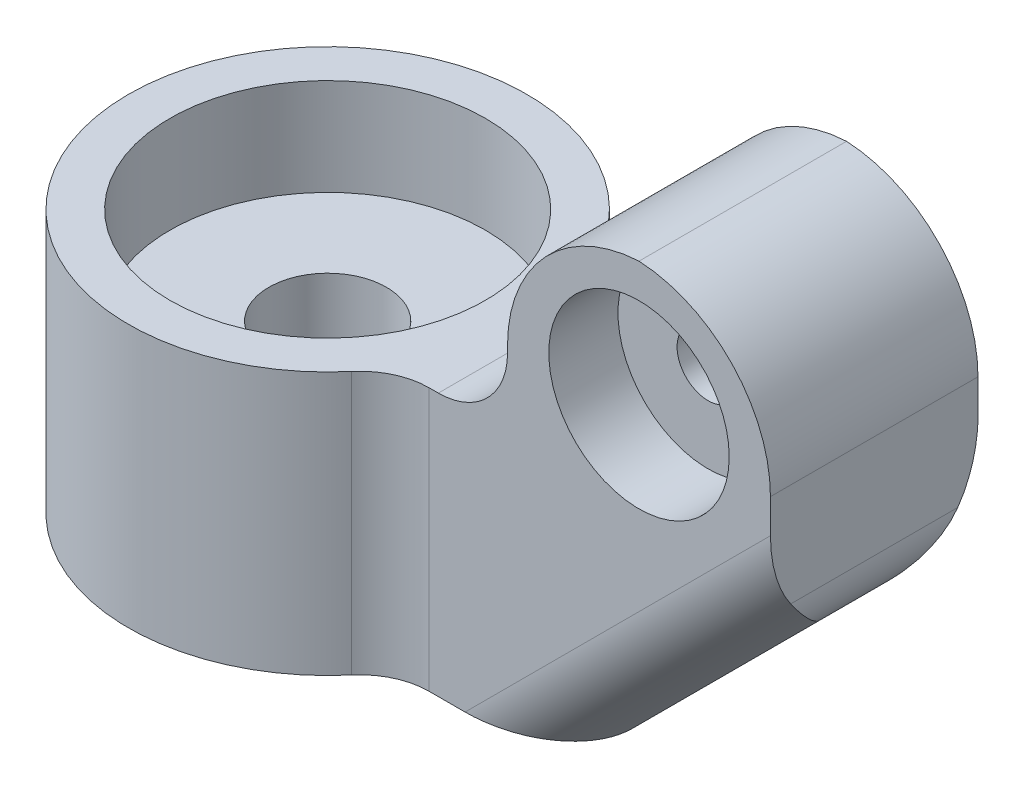
ISO-10303-21;
HEADER;
FILE_DESCRIPTION(('STEP AP214'),'2;1');
FILE_NAME('part.step','',(''),(''),'','','');
FILE_SCHEMA(('AUTOMOTIVE_DESIGN { 1 0 10303 214 1 1 1 1 }'));
ENDSEC;
DATA;
#1=APPLICATION_CONTEXT('core data for automotive mechanical design processes');
#2=APPLICATION_PROTOCOL_DEFINITION('international standard','automotive_design',2000,#1);
#3=PRODUCT_CONTEXT('',#1,'mechanical');
#4=PRODUCT('Part','Part','',(#3));
#5=PRODUCT_RELATED_PRODUCT_CATEGORY('part','',(#4));
#6=PRODUCT_DEFINITION_FORMATION('','',#4);
#7=PRODUCT_DEFINITION_CONTEXT('part definition',#1,'design');
#8=PRODUCT_DEFINITION('design','',#6,#7);
#9=PRODUCT_DEFINITION_SHAPE('','',#8);
#10=(LENGTH_UNIT() NAMED_UNIT(*) SI_UNIT(.MILLI.,.METRE.));
#11=(NAMED_UNIT(*) PLANE_ANGLE_UNIT() SI_UNIT($,.RADIAN.));
#12=(NAMED_UNIT(*) SI_UNIT($,.STERADIAN.) SOLID_ANGLE_UNIT());
#13=UNCERTAINTY_MEASURE_WITH_UNIT(LENGTH_MEASURE(1.E-05),#10,'distance_accuracy_value','');
#14=(GEOMETRIC_REPRESENTATION_CONTEXT(3) GLOBAL_UNCERTAINTY_ASSIGNED_CONTEXT((#13)) GLOBAL_UNIT_ASSIGNED_CONTEXT((#10,
#11,#12)) REPRESENTATION_CONTEXT('',''));
#15=CARTESIAN_POINT('',(0.,0.,0.));
#16=DIRECTION('',(0.,0.,1.));
#17=DIRECTION('',(1.,0.,0.));
#18=AXIS2_PLACEMENT_3D('',#15,#16,#17);
#19=CARTESIAN_POINT('',(-30.,-25.52,0.));
#20=DIRECTION('',(0.,1.,0.));
#21=DIRECTION('',(0.,0.,1.));
#22=AXIS2_PLACEMENT_3D('',#19,#20,#21);
#23=CYLINDRICAL_SURFACE('',#22,4.25);
#24=CARTESIAN_POINT('',(-30.,-13.52,0.));
#25=DIRECTION('',(0.,1.,0.));
#26=DIRECTION('',(0.,0.,1.));
#27=AXIS2_PLACEMENT_3D('',#24,#25,#26);
#28=CIRCLE('',#27,4.25);
#29=CARTESIAN_POINT('',(-30.,-13.52,4.25));
#30=VERTEX_POINT('',#29);
#31=EDGE_CURVE('E385',#30,#30,#28,.T.);
#32=ORIENTED_EDGE('',*,*,#31,.T.);
#33=EDGE_LOOP('',(#32));
#34=FACE_BOUND('',#33,.T.);
#35=CARTESIAN_POINT('',(-30.,-18.52,0.));
#36=DIRECTION('',(0.,-1.,0.));
#37=DIRECTION('',(1.,0.,0.));
#38=AXIS2_PLACEMENT_3D('',#35,#36,#37);
#39=CIRCLE('',#38,4.25);
#40=CARTESIAN_POINT('',(-25.75,-18.52,0.));
#41=VERTEX_POINT('',#40);
#42=EDGE_CURVE('E191',#41,#41,#39,.F.);
#43=ORIENTED_EDGE('',*,*,#42,.F.);
#44=EDGE_LOOP('',(#43));
#45=FACE_BOUND('',#44,.T.);
#46=ADVANCED_FACE('F46',(#34,#45),#23,.F.);
#47=CARTESIAN_POINT('',(0.,0.,7.5));
#48=DIRECTION('',(0.,0.,-1.));
#49=DIRECTION('',(-1.,0.,0.));
#50=AXIS2_PLACEMENT_3D('',#47,#48,#49);
#51=CYLINDRICAL_SURFACE('',#50,2.25);
#52=CARTESIAN_POINT('',(0.,0.,-2.5));
#53=DIRECTION('',(0.,0.,1.));
#54=DIRECTION('',(1.,0.,0.));
#55=AXIS2_PLACEMENT_3D('',#52,#53,#54);
#56=CIRCLE('',#55,2.25);
#57=CARTESIAN_POINT('',(2.25,0.,-2.5));
#58=VERTEX_POINT('',#57);
#59=EDGE_CURVE('E303',#58,#58,#56,.T.);
#60=ORIENTED_EDGE('',*,*,#59,.F.);
#61=EDGE_LOOP('',(#60));
#62=FACE_BOUND('',#61,.T.);
#63=CARTESIAN_POINT('',(0.,0.,2.5));
#64=DIRECTION('',(0.,0.,1.));
#65=DIRECTION('',(1.,0.,0.));
#66=AXIS2_PLACEMENT_3D('',#63,#64,#65);
#67=CIRCLE('',#66,2.25);
#68=CARTESIAN_POINT('',(2.25,0.,2.5));
#69=VERTEX_POINT('',#68);
#70=EDGE_CURVE('E299',#69,#69,#67,.T.);
#71=ORIENTED_EDGE('',*,*,#70,.T.);
#72=EDGE_LOOP('',(#71));
#73=FACE_BOUND('',#72,.T.);
#74=ADVANCED_FACE('F406',(#62,#73),#51,.F.);
#75=CARTESIAN_POINT('',(0.,-6.52,7.5));
#76=DIRECTION('',(0.,1.,0.));
#77=DIRECTION('',(0.,0.,1.));
#78=AXIS2_PLACEMENT_3D('',#75,#76,#77);
#79=PLANE('',#78);
#80=CARTESIAN_POINT('',(-30.,-6.52,0.));
#81=DIRECTION('',(0.,1.,0.));
#82=DIRECTION('',(0.,0.,1.));
#83=AXIS2_PLACEMENT_3D('',#80,#81,#82);
#84=CIRCLE('',#83,11.4);
#85=CARTESIAN_POINT('',(-30.,-6.52,11.4));
#86=VERTEX_POINT('',#85);
#87=EDGE_CURVE('E379',#86,#86,#84,.T.);
#88=ORIENTED_EDGE('',*,*,#87,.F.);
#89=EDGE_LOOP('',(#88));
#90=FACE_BOUND('',#89,.T.);
#91=DIRECTION('',(1.,0.,0.));
#92=VECTOR('',#91,1.);
#93=CARTESIAN_POINT('',(0.,-6.52,7.5));
#94=LINE('',#93,#92);
#95=CARTESIAN_POINT('',(-15.1638953899617,-6.52,7.5));
#96=VERTEX_POINT('',#95);
#97=CARTESIAN_POINT('',(-14.5,-6.52,7.5));
#98=VERTEX_POINT('',#97);
#99=EDGE_CURVE('E295',#96,#98,#94,.T.);
#100=ORIENTED_EDGE('',*,*,#99,.T.);
#101=DIRECTION('',(0.,0.,-1.));
#102=VECTOR('',#101,1.);
#103=CARTESIAN_POINT('',(-14.5,-6.52,-7.5));
#104=LINE('',#103,#102);
#105=CARTESIAN_POINT('',(-14.5,-6.52,-7.5));
#106=VERTEX_POINT('',#105);
#107=EDGE_CURVE('E196',#98,#106,#104,.T.);
#108=ORIENTED_EDGE('',*,*,#107,.T.);
#109=DIRECTION('',(1.,0.,0.));
#110=VECTOR('',#109,1.);
#111=CARTESIAN_POINT('',(0.,-6.52,-7.5));
#112=LINE('',#111,#110);
#113=CARTESIAN_POINT('',(-15.1638953899617,-6.52,-7.5));
#114=VERTEX_POINT('',#113);
#115=EDGE_CURVE('E163',#114,#106,#112,.T.);
#116=ORIENTED_EDGE('',*,*,#115,.F.);
#117=CARTESIAN_POINT('',(-15.1638953899617,-6.52,-12.5));
#118=DIRECTION('',(0.,1.,0.));
#119=DIRECTION('',(0.,0.,1.));
#120=AXIS2_PLACEMENT_3D('',#117,#118,#119);
#121=CIRCLE('',#120,5.);
#122=CARTESIAN_POINT('',(-18.987633691518,-6.52,-9.27835051546392));
#123=VERTEX_POINT('',#122);
#124=EDGE_CURVE('E175',#114,#123,#121,.F.);
#125=ORIENTED_EDGE('',*,*,#124,.T.);
#126=CARTESIAN_POINT('',(-30.,-6.52,0.));
#127=DIRECTION('',(0.,1.,0.));
#128=DIRECTION('',(0.,0.,1.));
#129=AXIS2_PLACEMENT_3D('',#126,#127,#128);
#130=CIRCLE('',#129,14.4);
#131=CARTESIAN_POINT('',(-18.987633691518,-6.52,9.27835051546392));
#132=VERTEX_POINT('',#131);
#133=EDGE_CURVE('E323',#123,#132,#130,.T.);
#134=ORIENTED_EDGE('',*,*,#133,.T.);
#135=CARTESIAN_POINT('',(-15.1638953899617,-6.52,12.5));
#136=DIRECTION('',(0.,1.,0.));
#137=DIRECTION('',(0.,0.,1.));
#138=AXIS2_PLACEMENT_3D('',#135,#136,#137);
#139=CIRCLE('',#138,5.);
#140=EDGE_CURVE('E214',#132,#96,#139,.F.);
#141=ORIENTED_EDGE('',*,*,#140,.T.);
#142=EDGE_LOOP('',(#100,#108,#116,#125,#134,#141));
#143=FACE_BOUND('',#142,.T.);
#144=ADVANCED_FACE('F343',(#90,#143),#79,.T.);
#145=CARTESIAN_POINT('',(0.,-25.52,7.5));
#146=DIRECTION('',(0.,-1.,0.));
#147=DIRECTION('',(1.,0.,0.));
#148=AXIS2_PLACEMENT_3D('',#145,#146,#147);
#149=PLANE('',#148);
#150=CARTESIAN_POINT('',(-30.,-25.52,0.));
#151=DIRECTION('',(0.,-1.,0.));
#152=DIRECTION('',(1.,0.,0.));
#153=AXIS2_PLACEMENT_3D('',#150,#151,#152);
#154=CIRCLE('',#153,11.4);
#155=CARTESIAN_POINT('',(-18.6,-25.52,0.));
#156=VERTEX_POINT('',#155);
#157=EDGE_CURVE('E243',#156,#156,#154,.T.);
#158=ORIENTED_EDGE('',*,*,#157,.F.);
#159=EDGE_LOOP('',(#158));
#160=FACE_BOUND('',#159,.T.);
#161=DIRECTION('',(-1.,0.,0.));
#162=VECTOR('',#161,1.);
#163=CARTESIAN_POINT('',(0.,-25.52,-7.5));
#164=LINE('',#163,#162);
#165=CARTESIAN_POINT('',(-12.5710678118655,-25.52,-7.5));
#166=VERTEX_POINT('',#165);
#167=CARTESIAN_POINT('',(-15.1638953899617,-25.52,-7.5));
#168=VERTEX_POINT('',#167);
#169=EDGE_CURVE('E150',#166,#168,#164,.T.);
#170=ORIENTED_EDGE('',*,*,#169,.F.);
#171=CARTESIAN_POINT('',(-12.5710678118655,-25.52,-2.5));
#172=DIRECTION('',(0.,-1.,0.));
#173=DIRECTION('',(1.,0.,0.));
#174=AXIS2_PLACEMENT_3D('',#171,#172,#173);
#175=ELLIPSE('',#174,7.07106781186548,5.);
#176=CARTESIAN_POINT('',(-5.5,-25.52,-2.5));
#177=VERTEX_POINT('',#176);
#178=EDGE_CURVE('E249',#166,#177,#175,.T.);
#179=ORIENTED_EDGE('',*,*,#178,.T.);
#180=DIRECTION('',(0.,0.,-1.));
#181=VECTOR('',#180,1.);
#182=CARTESIAN_POINT('',(-5.5,-25.52,7.5));
#183=LINE('',#182,#181);
#184=CARTESIAN_POINT('',(-5.5,-25.52,2.5));
#185=VERTEX_POINT('',#184);
#186=EDGE_CURVE('E180',#185,#177,#183,.T.);
#187=ORIENTED_EDGE('',*,*,#186,.F.);
#188=CARTESIAN_POINT('',(-12.5710678118655,-25.52,2.5));
#189=DIRECTION('',(0.,-1.,0.));
#190=DIRECTION('',(-1.,0.,0.));
#191=AXIS2_PLACEMENT_3D('',#188,#189,#190);
#192=ELLIPSE('',#191,7.07106781186548,5.);
#193=CARTESIAN_POINT('',(-12.5710678118655,-25.52,7.5));
#194=VERTEX_POINT('',#193);
#195=EDGE_CURVE('E246',#185,#194,#192,.T.);
#196=ORIENTED_EDGE('',*,*,#195,.T.);
#197=DIRECTION('',(-1.,0.,0.));
#198=VECTOR('',#197,1.);
#199=CARTESIAN_POINT('',(0.,-25.52,7.5));
#200=LINE('',#199,#198);
#201=CARTESIAN_POINT('',(-15.1638953899617,-25.52,7.5));
#202=VERTEX_POINT('',#201);
#203=EDGE_CURVE('E332',#194,#202,#200,.T.);
#204=ORIENTED_EDGE('',*,*,#203,.T.);
#205=CARTESIAN_POINT('',(-15.1638953899617,-25.52,12.5));
#206=DIRECTION('',(0.,-1.,0.));
#207=DIRECTION('',(1.,0.,0.));
#208=AXIS2_PLACEMENT_3D('',#205,#206,#207);
#209=CIRCLE('',#208,5.);
#210=CARTESIAN_POINT('',(-18.987633691518,-25.52,9.27835051546392));
#211=VERTEX_POINT('',#210);
#212=EDGE_CURVE('E217',#202,#211,#209,.F.);
#213=ORIENTED_EDGE('',*,*,#212,.T.);
#214=CARTESIAN_POINT('',(-30.,-25.52,0.));
#215=DIRECTION('',(0.,1.,0.));
#216=DIRECTION('',(0.,0.,1.));
#217=AXIS2_PLACEMENT_3D('',#214,#215,#216);
#218=CIRCLE('',#217,14.4);
#219=CARTESIAN_POINT('',(-18.987633691518,-25.52,-9.27835051546392));
#220=VERTEX_POINT('',#219);
#221=EDGE_CURVE('E170',#220,#211,#218,.T.);
#222=ORIENTED_EDGE('',*,*,#221,.F.);
#223=CARTESIAN_POINT('',(-15.1638953899617,-25.52,-12.5));
#224=DIRECTION('',(0.,-1.,0.));
#225=DIRECTION('',(1.,0.,0.));
#226=AXIS2_PLACEMENT_3D('',#223,#224,#225);
#227=CIRCLE('',#226,5.);
#228=EDGE_CURVE('E167',#220,#168,#227,.F.);
#229=ORIENTED_EDGE('',*,*,#228,.T.);
#230=EDGE_LOOP('',(#170,#179,#187,#196,#204,#213,#222,#229));
#231=FACE_BOUND('',#230,.T.);
#232=ADVANCED_FACE('F168',(#160,#231),#149,.T.);
#233=CARTESIAN_POINT('',(10.01,-10.01,7.5));
#234=DIRECTION('',(0.707106781186547,-0.707106781186547,0.));
#235=DIRECTION('',(0.707106781186548,0.707106781186548,0.));
#236=AXIS2_PLACEMENT_3D('',#233,#234,#235);
#237=PLANE('',#236);
#238=ORIENTED_EDGE('',*,*,#186,.T.);
#239=DIRECTION('',(-0.707106781186548,-0.707106781186548,0.));
#240=VECTOR('',#239,1.);
#241=CARTESIAN_POINT('',(9.5,-10.52,-2.5));
#242=LINE('',#241,#240);
#243=CARTESIAN_POINT('',(8.03553390593274,-11.9844660940673,-2.5));
#244=VERTEX_POINT('',#243);
#245=EDGE_CURVE('E258',#177,#244,#242,.F.);
#246=ORIENTED_EDGE('',*,*,#245,.T.);
#247=DIRECTION('',(0.,0.,-1.));
#248=VECTOR('',#247,1.);
#249=CARTESIAN_POINT('',(8.03553390593274,-11.9844660940673,7.5));
#250=LINE('',#249,#248);
#251=CARTESIAN_POINT('',(8.03553390593274,-11.9844660940673,2.5));
#252=VERTEX_POINT('',#251);
#253=EDGE_CURVE('E252',#244,#252,#250,.F.);
#254=ORIENTED_EDGE('',*,*,#253,.T.);
#255=DIRECTION('',(-0.707106781186548,-0.707106781186548,0.));
#256=VECTOR('',#255,1.);
#257=CARTESIAN_POINT('',(10.01,-10.01,2.5));
#258=LINE('',#257,#256);
#259=EDGE_CURVE('E255',#252,#185,#258,.T.);
#260=ORIENTED_EDGE('',*,*,#259,.T.);
#261=EDGE_LOOP('',(#238,#246,#254,#260));
#262=FACE_BOUND('',#261,.T.);
#263=ADVANCED_FACE('F283',(#262),#237,.T.);
#264=CARTESIAN_POINT('',(9.5,0.,7.5));
#265=DIRECTION('',(1.,0.,0.));
#266=DIRECTION('',(0.,1.,0.));
#267=AXIS2_PLACEMENT_3D('',#264,#265,#266);
#268=PLANE('',#267);
#269=DIRECTION('',(0.,0.,-1.));
#270=VECTOR('',#269,1.);
#271=CARTESIAN_POINT('',(9.5,-8.44893218813453,7.5));
#272=LINE('',#271,#270);
#273=CARTESIAN_POINT('',(9.5,-8.44893218813453,6.03553390593274));
#274=VERTEX_POINT('',#273);
#275=CARTESIAN_POINT('',(9.5,-8.44893218813453,-6.03553390593274));
#276=VERTEX_POINT('',#275);
#277=EDGE_CURVE('E64',#274,#276,#272,.T.);
#278=ORIENTED_EDGE('',*,*,#277,.T.);
#279=CARTESIAN_POINT('',(9.5,-3.44893218813453,-2.5));
#280=DIRECTION('',(1.,0.,0.));
#281=DIRECTION('',(0.,1.,0.));
#282=AXIS2_PLACEMENT_3D('',#279,#280,#281);
#283=ELLIPSE('',#282,7.07106781186547,5.);
#284=CARTESIAN_POINT('',(9.5,-3.44893218813453,-7.5));
#285=VERTEX_POINT('',#284);
#286=EDGE_CURVE('E56',#276,#285,#283,.T.);
#287=ORIENTED_EDGE('',*,*,#286,.T.);
#288=DIRECTION('',(0.,-1.,0.));
#289=VECTOR('',#288,1.);
#290=CARTESIAN_POINT('',(9.5,0.,-7.5));
#291=LINE('',#290,#289);
#292=CARTESIAN_POINT('',(9.5,-1.,-7.5));
#293=VERTEX_POINT('',#292);
#294=EDGE_CURVE('E162',#293,#285,#291,.T.);
#295=ORIENTED_EDGE('',*,*,#294,.F.);
#296=DIRECTION('',(0.,0.,-1.));
#297=VECTOR('',#296,1.);
#298=CARTESIAN_POINT('',(9.5,-1.,7.5));
#299=LINE('',#298,#297);
#300=CARTESIAN_POINT('',(9.5,-1.,7.5));
#301=VERTEX_POINT('',#300);
#302=EDGE_CURVE('E236',#293,#301,#299,.F.);
#303=ORIENTED_EDGE('',*,*,#302,.T.);
#304=DIRECTION('',(0.,-1.,0.));
#305=VECTOR('',#304,1.);
#306=CARTESIAN_POINT('',(9.5,0.,7.5));
#307=LINE('',#306,#305);
#308=CARTESIAN_POINT('',(9.5,-3.44893218813453,7.5));
#309=VERTEX_POINT('',#308);
#310=EDGE_CURVE('E335',#301,#309,#307,.T.);
#311=ORIENTED_EDGE('',*,*,#310,.T.);
#312=CARTESIAN_POINT('',(9.5,-3.44893218813453,2.5));
#313=DIRECTION('',(1.,0.,0.));
#314=DIRECTION('',(0.,-1.,0.));
#315=AXIS2_PLACEMENT_3D('',#312,#313,#314);
#316=ELLIPSE('',#315,7.07106781186547,5.);
#317=EDGE_CURVE('E69',#309,#274,#316,.T.);
#318=ORIENTED_EDGE('',*,*,#317,.T.);
#319=EDGE_LOOP('',(#278,#287,#295,#303,#311,#318));
#320=FACE_BOUND('',#319,.T.);
#321=ADVANCED_FACE('F287',(#320),#268,.T.);
#322=CARTESIAN_POINT('',(-9.5,0.,7.5));
#323=DIRECTION('',(-1.,0.,0.));
#324=DIRECTION('',(0.,0.,1.));
#325=AXIS2_PLACEMENT_3D('',#322,#323,#324);
#326=PLANE('',#325);
#327=DIRECTION('',(0.,1.,0.));
#328=VECTOR('',#327,1.);
#329=CARTESIAN_POINT('',(-9.5,0.,7.5));
#330=LINE('',#329,#328);
#331=CARTESIAN_POINT('',(-9.5,-1.52,7.5));
#332=VERTEX_POINT('',#331);
#333=CARTESIAN_POINT('',(-9.5,-1.,7.5));
#334=VERTEX_POINT('',#333);
#335=EDGE_CURVE('E188',#332,#334,#330,.T.);
#336=ORIENTED_EDGE('',*,*,#335,.T.);
#337=DIRECTION('',(0.,0.,-1.));
#338=VECTOR('',#337,1.);
#339=CARTESIAN_POINT('',(-9.5,-1.,7.5));
#340=LINE('',#339,#338);
#341=CARTESIAN_POINT('',(-9.5,-1.,-7.5));
#342=VERTEX_POINT('',#341);
#343=EDGE_CURVE('E220',#334,#342,#340,.T.);
#344=ORIENTED_EDGE('',*,*,#343,.T.);
#345=DIRECTION('',(0.,1.,0.));
#346=VECTOR('',#345,1.);
#347=CARTESIAN_POINT('',(-9.5,0.,-7.5));
#348=LINE('',#347,#346);
#349=CARTESIAN_POINT('',(-9.5,-1.52,-7.5));
#350=VERTEX_POINT('',#349);
#351=EDGE_CURVE('E291',#350,#342,#348,.T.);
#352=ORIENTED_EDGE('',*,*,#351,.F.);
#353=DIRECTION('',(0.,0.,-1.));
#354=VECTOR('',#353,1.);
#355=CARTESIAN_POINT('',(-9.5,-1.52,7.5));
#356=LINE('',#355,#354);
#357=EDGE_CURVE('E200',#350,#332,#356,.F.);
#358=ORIENTED_EDGE('',*,*,#357,.T.);
#359=EDGE_LOOP('',(#336,#344,#352,#358));
#360=FACE_BOUND('',#359,.T.);
#361=ADVANCED_FACE('F354',(#360),#326,.T.);
#362=CARTESIAN_POINT('',(0.,0.,7.5));
#363=DIRECTION('',(0.,0.,1.));
#364=DIRECTION('',(1.,0.,0.));
#365=AXIS2_PLACEMENT_3D('',#362,#363,#364);
#366=PLANE('',#365);
#367=ORIENTED_EDGE('',*,*,#203,.F.);
#368=DIRECTION('',(-0.707106781186548,-0.707106781186548,0.));
#369=VECTOR('',#368,1.);
#370=CARTESIAN_POINT('',(6.47446609406726,-6.47446609406726,7.5));
#371=LINE('',#370,#369);
#372=EDGE_CURVE('E12',#194,#309,#371,.F.);
#373=ORIENTED_EDGE('',*,*,#372,.T.);
#374=ORIENTED_EDGE('',*,*,#310,.F.);
#375=CARTESIAN_POINT('',(-0.5,-1.,7.5));
#376=DIRECTION('',(0.,0.,1.));
#377=DIRECTION('',(1.,0.,0.));
#378=AXIS2_PLACEMENT_3D('',#375,#376,#377);
#379=CIRCLE('',#378,10.);
#380=CARTESIAN_POINT('',(0.,8.98749217771909,7.5));
#381=VERTEX_POINT('',#380);
#382=EDGE_CURVE('E230',#301,#381,#379,.T.);
#383=ORIENTED_EDGE('',*,*,#382,.T.);
#384=CARTESIAN_POINT('',(0.5,-1.,7.5));
#385=DIRECTION('',(0.,0.,1.));
#386=DIRECTION('',(1.,0.,0.));
#387=AXIS2_PLACEMENT_3D('',#384,#385,#386);
#388=CIRCLE('',#387,10.);
#389=EDGE_CURVE('E233',#381,#334,#388,.T.);
#390=ORIENTED_EDGE('',*,*,#389,.T.);
#391=ORIENTED_EDGE('',*,*,#335,.F.);
#392=CARTESIAN_POINT('',(-14.5,-1.52,7.5));
#393=DIRECTION('',(0.,0.,1.));
#394=DIRECTION('',(1.,0.,0.));
#395=AXIS2_PLACEMENT_3D('',#392,#393,#394);
#396=CIRCLE('',#395,5.);
#397=EDGE_CURVE('E211',#332,#98,#396,.F.);
#398=ORIENTED_EDGE('',*,*,#397,.T.);
#399=ORIENTED_EDGE('',*,*,#99,.F.);
#400=DIRECTION('',(0.,-1.,0.));
#401=VECTOR('',#400,1.);
#402=CARTESIAN_POINT('',(-15.1638953899617,-25.52,7.5));
#403=LINE('',#402,#401);
#404=EDGE_CURVE('E203',#96,#202,#403,.T.);
#405=ORIENTED_EDGE('',*,*,#404,.T.);
#406=EDGE_LOOP('',(#367,#373,#374,#383,#390,#391,#398,#399,#405));
#407=FACE_BOUND('',#406,.T.);
#408=CARTESIAN_POINT('',(0.,0.,7.5));
#409=DIRECTION('',(0.,0.,1.));
#410=DIRECTION('',(1.,0.,0.));
#411=AXIS2_PLACEMENT_3D('',#408,#409,#410);
#412=CIRCLE('',#411,6.52);
#413=CARTESIAN_POINT('',(6.52,0.,7.5));
#414=VERTEX_POINT('',#413);
#415=EDGE_CURVE('E306',#414,#414,#412,.T.);
#416=ORIENTED_EDGE('',*,*,#415,.F.);
#417=EDGE_LOOP('',(#416));
#418=FACE_BOUND('',#417,.T.);
#419=ADVANCED_FACE('F357',(#407,#418),#366,.T.);
#420=CARTESIAN_POINT('',(0.,0.,-7.5));
#421=DIRECTION('',(0.,0.,1.));
#422=DIRECTION('',(1.,0.,0.));
#423=AXIS2_PLACEMENT_3D('',#420,#421,#422);
#424=PLANE('',#423);
#425=CARTESIAN_POINT('',(0.,0.,-7.5));
#426=DIRECTION('',(0.,0.,1.));
#427=DIRECTION('',(1.,0.,0.));
#428=AXIS2_PLACEMENT_3D('',#425,#426,#427);
#429=CIRCLE('',#428,6.52);
#430=CARTESIAN_POINT('',(6.52,0.,-7.5));
#431=VERTEX_POINT('',#430);
#432=EDGE_CURVE('E315',#431,#431,#429,.T.);
#433=ORIENTED_EDGE('',*,*,#432,.T.);
#434=EDGE_LOOP('',(#433));
#435=FACE_BOUND('',#434,.T.);
#436=ORIENTED_EDGE('',*,*,#294,.T.);
#437=DIRECTION('',(-0.707106781186548,-0.707106781186548,0.));
#438=VECTOR('',#437,1.);
#439=CARTESIAN_POINT('',(-9.03553390593273,-21.9844660940673,-7.5));
#440=LINE('',#439,#438);
#441=EDGE_CURVE('E159',#285,#166,#440,.T.);
#442=ORIENTED_EDGE('',*,*,#441,.T.);
#443=ORIENTED_EDGE('',*,*,#169,.T.);
#444=DIRECTION('',(0.,1.,0.));
#445=VECTOR('',#444,1.);
#446=CARTESIAN_POINT('',(-15.1638953899617,0.,-7.5));
#447=LINE('',#446,#445);
#448=EDGE_CURVE('E156',#168,#114,#447,.T.);
#449=ORIENTED_EDGE('',*,*,#448,.T.);
#450=ORIENTED_EDGE('',*,*,#115,.T.);
#451=CARTESIAN_POINT('',(-14.5,-1.52,-7.5));
#452=DIRECTION('',(0.,0.,1.));
#453=DIRECTION('',(1.,0.,0.));
#454=AXIS2_PLACEMENT_3D('',#451,#452,#453);
#455=CIRCLE('',#454,5.);
#456=EDGE_CURVE('E174',#106,#350,#455,.T.);
#457=ORIENTED_EDGE('',*,*,#456,.T.);
#458=ORIENTED_EDGE('',*,*,#351,.T.);
#459=CARTESIAN_POINT('',(0.5,-1.,-7.5));
#460=DIRECTION('',(0.,0.,1.));
#461=DIRECTION('',(1.,0.,0.));
#462=AXIS2_PLACEMENT_3D('',#459,#460,#461);
#463=CIRCLE('',#462,10.);
#464=CARTESIAN_POINT('',(0.,8.98749217771909,-7.5));
#465=VERTEX_POINT('',#464);
#466=EDGE_CURVE('E227',#342,#465,#463,.F.);
#467=ORIENTED_EDGE('',*,*,#466,.T.);
#468=CARTESIAN_POINT('',(-0.5,-1.,-7.5));
#469=DIRECTION('',(0.,0.,1.));
#470=DIRECTION('',(1.,0.,0.));
#471=AXIS2_PLACEMENT_3D('',#468,#469,#470);
#472=CIRCLE('',#471,10.);
#473=EDGE_CURVE('E224',#465,#293,#472,.F.);
#474=ORIENTED_EDGE('',*,*,#473,.T.);
#475=EDGE_LOOP('',(#436,#442,#443,#449,#450,#457,#458,#467,#474));
#476=FACE_BOUND('',#475,.T.);
#477=ADVANCED_FACE('F153',(#435,#476),#424,.F.);
#478=CARTESIAN_POINT('',(0.,0.,2.5));
#479=DIRECTION('',(0.,0.,1.));
#480=DIRECTION('',(1.,0.,0.));
#481=AXIS2_PLACEMENT_3D('',#478,#479,#480);
#482=CYLINDRICAL_SURFACE('',#481,6.52);
#483=CARTESIAN_POINT('',(0.,0.,2.5));
#484=DIRECTION('',(0.,0.,1.));
#485=DIRECTION('',(1.,0.,0.));
#486=AXIS2_PLACEMENT_3D('',#483,#484,#485);
#487=CIRCLE('',#486,6.52);
#488=CARTESIAN_POINT('',(6.52,0.,2.5));
#489=VERTEX_POINT('',#488);
#490=EDGE_CURVE('E302',#489,#489,#487,.T.);
#491=ORIENTED_EDGE('',*,*,#490,.F.);
#492=EDGE_LOOP('',(#491));
#493=FACE_BOUND('',#492,.T.);
#494=ORIENTED_EDGE('',*,*,#415,.T.);
#495=EDGE_LOOP('',(#494));
#496=FACE_BOUND('',#495,.T.);
#497=ADVANCED_FACE('F429',(#493,#496),#482,.F.);
#498=CARTESIAN_POINT('',(0.,0.,2.5));
#499=DIRECTION('',(0.,0.,1.));
#500=DIRECTION('',(1.,0.,0.));
#501=AXIS2_PLACEMENT_3D('',#498,#499,#500);
#502=PLANE('',#501);
#503=ORIENTED_EDGE('',*,*,#70,.F.);
#504=EDGE_LOOP('',(#503));
#505=FACE_BOUND('',#504,.T.);
#506=ORIENTED_EDGE('',*,*,#490,.T.);
#507=EDGE_LOOP('',(#506));
#508=FACE_BOUND('',#507,.T.);
#509=ADVANCED_FACE('F426',(#505,#508),#502,.T.);
#510=CARTESIAN_POINT('',(0.,0.,-2.5));
#511=DIRECTION('',(0.,0.,-1.));
#512=DIRECTION('',(-1.,0.,0.));
#513=AXIS2_PLACEMENT_3D('',#510,#511,#512);
#514=CYLINDRICAL_SURFACE('',#513,6.52);
#515=CARTESIAN_POINT('',(0.,0.,-2.5));
#516=DIRECTION('',(0.,0.,1.));
#517=DIRECTION('',(1.,0.,0.));
#518=AXIS2_PLACEMENT_3D('',#515,#516,#517);
#519=CIRCLE('',#518,6.52);
#520=CARTESIAN_POINT('',(6.52,0.,-2.5));
#521=VERTEX_POINT('',#520);
#522=EDGE_CURVE('E307',#521,#521,#519,.T.);
#523=ORIENTED_EDGE('',*,*,#522,.T.);
#524=EDGE_LOOP('',(#523));
#525=FACE_BOUND('',#524,.T.);
#526=ORIENTED_EDGE('',*,*,#432,.F.);
#527=EDGE_LOOP('',(#526));
#528=FACE_BOUND('',#527,.T.);
#529=ADVANCED_FACE('F423',(#525,#528),#514,.F.);
#530=CARTESIAN_POINT('',(0.,0.,-2.5));
#531=DIRECTION('',(0.,0.,1.));
#532=DIRECTION('',(1.,0.,0.));
#533=AXIS2_PLACEMENT_3D('',#530,#531,#532);
#534=PLANE('',#533);
#535=ORIENTED_EDGE('',*,*,#59,.T.);
#536=EDGE_LOOP('',(#535));
#537=FACE_BOUND('',#536,.T.);
#538=ORIENTED_EDGE('',*,*,#522,.F.);
#539=EDGE_LOOP('',(#538));
#540=FACE_BOUND('',#539,.T.);
#541=ADVANCED_FACE('F420',(#537,#540),#534,.F.);
#542=CARTESIAN_POINT('',(-30.,-25.52,0.));
#543=DIRECTION('',(0.,1.,0.));
#544=DIRECTION('',(0.,0.,1.));
#545=AXIS2_PLACEMENT_3D('',#542,#543,#544);
#546=CYLINDRICAL_SURFACE('',#545,14.4);
#547=ORIENTED_EDGE('',*,*,#133,.F.);
#548=DIRECTION('',(0.,1.,0.));
#549=VECTOR('',#548,1.);
#550=CARTESIAN_POINT('',(-18.987633691518,-25.52,-9.27835051546392));
#551=LINE('',#550,#549);
#552=EDGE_CURVE('E185',#123,#220,#551,.F.);
#553=ORIENTED_EDGE('',*,*,#552,.T.);
#554=ORIENTED_EDGE('',*,*,#221,.T.);
#555=DIRECTION('',(0.,1.,0.));
#556=VECTOR('',#555,1.);
#557=CARTESIAN_POINT('',(-18.987633691518,-25.52,9.27835051546392));
#558=LINE('',#557,#556);
#559=EDGE_CURVE('E179',#211,#132,#558,.T.);
#560=ORIENTED_EDGE('',*,*,#559,.T.);
#561=EDGE_LOOP('',(#547,#553,#554,#560));
#562=FACE_BOUND('',#561,.T.);
#563=ADVANCED_FACE('F372',(#562),#546,.T.);
#564=CARTESIAN_POINT('',(-30.,-13.52,0.));
#565=DIRECTION('',(0.,1.,0.));
#566=DIRECTION('',(0.,0.,1.));
#567=AXIS2_PLACEMENT_3D('',#564,#565,#566);
#568=CYLINDRICAL_SURFACE('',#567,11.4);
#569=CARTESIAN_POINT('',(-30.,-13.52,0.));
#570=DIRECTION('',(0.,1.,0.));
#571=DIRECTION('',(0.,0.,1.));
#572=AXIS2_PLACEMENT_3D('',#569,#570,#571);
#573=CIRCLE('',#572,11.4);
#574=CARTESIAN_POINT('',(-30.,-13.52,11.4));
#575=VERTEX_POINT('',#574);
#576=EDGE_CURVE('E376',#575,#575,#573,.T.);
#577=ORIENTED_EDGE('',*,*,#576,.F.);
#578=EDGE_LOOP('',(#577));
#579=FACE_BOUND('',#578,.T.);
#580=ORIENTED_EDGE('',*,*,#87,.T.);
#581=EDGE_LOOP('',(#580));
#582=FACE_BOUND('',#581,.T.);
#583=ADVANCED_FACE('F416',(#579,#582),#568,.F.);
#584=CARTESIAN_POINT('',(-30.,-13.52,0.));
#585=DIRECTION('',(0.,1.,0.));
#586=DIRECTION('',(0.,0.,1.));
#587=AXIS2_PLACEMENT_3D('',#584,#585,#586);
#588=PLANE('',#587);
#589=ORIENTED_EDGE('',*,*,#31,.F.);
#590=EDGE_LOOP('',(#589));
#591=FACE_BOUND('',#590,.T.);
#592=ORIENTED_EDGE('',*,*,#576,.T.);
#593=EDGE_LOOP('',(#592));
#594=FACE_BOUND('',#593,.T.);
#595=ADVANCED_FACE('F505',(#591,#594),#588,.T.);
#596=CARTESIAN_POINT('',(-30.,-18.52,0.));
#597=DIRECTION('',(0.,-1.,0.));
#598=DIRECTION('',(1.,0.,0.));
#599=AXIS2_PLACEMENT_3D('',#596,#597,#598);
#600=PLANE('',#599);
#601=CARTESIAN_POINT('',(-30.,-18.52,0.));
#602=DIRECTION('',(0.,-1.,0.));
#603=DIRECTION('',(1.,0.,0.));
#604=AXIS2_PLACEMENT_3D('',#601,#602,#603);
#605=CIRCLE('',#604,11.4);
#606=CARTESIAN_POINT('',(-18.6,-18.52,0.));
#607=VERTEX_POINT('',#606);
#608=EDGE_CURVE('E394',#607,#607,#605,.T.);
#609=ORIENTED_EDGE('',*,*,#608,.T.);
#610=EDGE_LOOP('',(#609));
#611=FACE_BOUND('',#610,.T.);
#612=ORIENTED_EDGE('',*,*,#42,.T.);
#613=EDGE_LOOP('',(#612));
#614=FACE_BOUND('',#613,.T.);
#615=ADVANCED_FACE('F403',(#611,#614),#600,.T.);
#616=CARTESIAN_POINT('',(-30.,-18.52,0.));
#617=DIRECTION('',(0.,-1.,0.));
#618=DIRECTION('',(0.,0.,-1.));
#619=AXIS2_PLACEMENT_3D('',#616,#617,#618);
#620=CYLINDRICAL_SURFACE('',#619,11.4);
#621=ORIENTED_EDGE('',*,*,#608,.F.);
#622=EDGE_LOOP('',(#621));
#623=FACE_BOUND('',#622,.T.);
#624=ORIENTED_EDGE('',*,*,#157,.T.);
#625=EDGE_LOOP('',(#624));
#626=FACE_BOUND('',#625,.T.);
#627=ADVANCED_FACE('F453',(#623,#626),#620,.F.);
#628=CARTESIAN_POINT('',(-15.1638953899617,-25.52,-12.5));
#629=DIRECTION('',(0.,1.,0.));
#630=DIRECTION('',(0.,0.,1.));
#631=AXIS2_PLACEMENT_3D('',#628,#629,#630);
#632=CYLINDRICAL_SURFACE('',#631,5.);
#633=ORIENTED_EDGE('',*,*,#228,.F.);
#634=ORIENTED_EDGE('',*,*,#552,.F.);
#635=ORIENTED_EDGE('',*,*,#124,.F.);
#636=ORIENTED_EDGE('',*,*,#448,.F.);
#637=EDGE_LOOP('',(#633,#634,#635,#636));
#638=FACE_BOUND('',#637,.T.);
#639=ADVANCED_FACE('F177',(#638),#632,.F.);
#640=CARTESIAN_POINT('',(-14.5,-1.52,7.5));
#641=DIRECTION('',(0.,0.,1.));
#642=DIRECTION('',(1.,0.,0.));
#643=AXIS2_PLACEMENT_3D('',#640,#641,#642);
#644=CYLINDRICAL_SURFACE('',#643,5.);
#645=ORIENTED_EDGE('',*,*,#397,.F.);
#646=ORIENTED_EDGE('',*,*,#357,.F.);
#647=ORIENTED_EDGE('',*,*,#456,.F.);
#648=ORIENTED_EDGE('',*,*,#107,.F.);
#649=EDGE_LOOP('',(#645,#646,#647,#648));
#650=FACE_BOUND('',#649,.T.);
#651=ADVANCED_FACE('F350',(#650),#644,.F.);
#652=CARTESIAN_POINT('',(-15.1638953899617,-25.52,12.5));
#653=DIRECTION('',(0.,1.,0.));
#654=DIRECTION('',(0.,0.,1.));
#655=AXIS2_PLACEMENT_3D('',#652,#653,#654);
#656=CYLINDRICAL_SURFACE('',#655,5.);
#657=ORIENTED_EDGE('',*,*,#212,.F.);
#658=ORIENTED_EDGE('',*,*,#404,.F.);
#659=ORIENTED_EDGE('',*,*,#140,.F.);
#660=ORIENTED_EDGE('',*,*,#559,.F.);
#661=EDGE_LOOP('',(#657,#658,#659,#660));
#662=FACE_BOUND('',#661,.T.);
#663=ADVANCED_FACE('F374',(#662),#656,.F.);
#664=CARTESIAN_POINT('',(-0.5,-1.,7.5));
#665=DIRECTION('',(0.,0.,-1.));
#666=DIRECTION('',(-1.,0.,0.));
#667=AXIS2_PLACEMENT_3D('',#664,#665,#666);
#668=CYLINDRICAL_SURFACE('',#667,10.);
#669=DIRECTION('',(0.,0.,-1.));
#670=VECTOR('',#669,1.);
#671=CARTESIAN_POINT('',(0.,8.98749217771909,0.));
#672=LINE('',#671,#670);
#673=EDGE_CURVE('E239',#381,#465,#672,.T.);
#674=ORIENTED_EDGE('',*,*,#673,.F.);
#675=ORIENTED_EDGE('',*,*,#382,.F.);
#676=ORIENTED_EDGE('',*,*,#302,.F.);
#677=ORIENTED_EDGE('',*,*,#473,.F.);
#678=EDGE_LOOP('',(#674,#675,#676,#677));
#679=FACE_BOUND('',#678,.T.);
#680=ADVANCED_FACE('F366',(#679),#668,.T.);
#681=CARTESIAN_POINT('',(0.5,-1.,7.5));
#682=DIRECTION('',(0.,0.,-1.));
#683=DIRECTION('',(-1.,0.,0.));
#684=AXIS2_PLACEMENT_3D('',#681,#682,#683);
#685=CYLINDRICAL_SURFACE('',#684,10.);
#686=ORIENTED_EDGE('',*,*,#389,.F.);
#687=ORIENTED_EDGE('',*,*,#673,.T.);
#688=ORIENTED_EDGE('',*,*,#466,.F.);
#689=ORIENTED_EDGE('',*,*,#343,.F.);
#690=EDGE_LOOP('',(#686,#687,#688,#689));
#691=FACE_BOUND('',#690,.T.);
#692=ADVANCED_FACE('F364',(#691),#685,.T.);
#693=CARTESIAN_POINT('',(6.47446609406726,-6.47446609406726,2.5));
#694=DIRECTION('',(-0.707106781186548,-0.707106781186548,0.));
#695=DIRECTION('',(0.707106781186548,-0.707106781186548,0.));
#696=AXIS2_PLACEMENT_3D('',#693,#694,#695);
#697=CYLINDRICAL_SURFACE('',#696,5.);
#698=ORIENTED_EDGE('',*,*,#195,.F.);
#699=ORIENTED_EDGE('',*,*,#259,.F.);
#700=CARTESIAN_POINT('',(4.5,-8.44893218813453,2.5));
#701=DIRECTION('',(0.5,0.5,-0.707106781186547));
#702=DIRECTION('',(-0.5,-0.5,-0.707106781186547));
#703=AXIS2_PLACEMENT_3D('',#700,#701,#702);
#704=ELLIPSE('',#703,7.07106781186547,5.);
#705=EDGE_CURVE('E50',#274,#252,#704,.T.);
#706=ORIENTED_EDGE('',*,*,#705,.F.);
#707=ORIENTED_EDGE('',*,*,#317,.F.);
#708=ORIENTED_EDGE('',*,*,#372,.F.);
#709=EDGE_LOOP('',(#698,#699,#706,#707,#708));
#710=FACE_BOUND('',#709,.T.);
#711=ADVANCED_FACE('F48',(#710),#697,.T.);
#712=CARTESIAN_POINT('',(4.5,-8.44893218813453,7.5));
#713=DIRECTION('',(0.,0.,-1.));
#714=DIRECTION('',(-1.,0.,0.));
#715=AXIS2_PLACEMENT_3D('',#712,#713,#714);
#716=CYLINDRICAL_SURFACE('',#715,5.);
#717=ORIENTED_EDGE('',*,*,#705,.T.);
#718=ORIENTED_EDGE('',*,*,#253,.F.);
#719=CARTESIAN_POINT('',(4.5,-8.44893218813453,-2.5));
#720=DIRECTION('',(-0.5,-0.5,-0.707106781186547));
#721=DIRECTION('',(0.5,0.5,-0.707106781186547));
#722=AXIS2_PLACEMENT_3D('',#719,#720,#721);
#723=ELLIPSE('',#722,7.07106781186547,5.);
#724=EDGE_CURVE('E266',#276,#244,#723,.T.);
#725=ORIENTED_EDGE('',*,*,#724,.F.);
#726=ORIENTED_EDGE('',*,*,#277,.F.);
#727=EDGE_LOOP('',(#717,#718,#725,#726));
#728=FACE_BOUND('',#727,.T.);
#729=ADVANCED_FACE('F276',(#728),#716,.T.);
#730=CARTESIAN_POINT('',(6.47446609406727,-6.47446609406727,-2.5));
#731=DIRECTION('',(0.707106781186548,0.707106781186548,0.));
#732=DIRECTION('',(-0.707106781186548,0.707106781186548,0.));
#733=AXIS2_PLACEMENT_3D('',#730,#731,#732);
#734=CYLINDRICAL_SURFACE('',#733,5.);
#735=ORIENTED_EDGE('',*,*,#724,.T.);
#736=ORIENTED_EDGE('',*,*,#245,.F.);
#737=ORIENTED_EDGE('',*,*,#178,.F.);
#738=ORIENTED_EDGE('',*,*,#441,.F.);
#739=ORIENTED_EDGE('',*,*,#286,.F.);
#740=EDGE_LOOP('',(#735,#736,#737,#738,#739));
#741=FACE_BOUND('',#740,.T.);
#742=ADVANCED_FACE('F285',(#741),#734,.T.);
#743=CLOSED_SHELL('',(#46,#74,#144,#232,#263,#321,#361,#419,#477,#497,#509,#529,#541,#563,#583,
#595,#615,#627,#639,#651,#663,#680,#692,#711,#729,#742));
#744=MANIFOLD_SOLID_BREP('B2',#743);
#745=ADVANCED_BREP_SHAPE_REPRESENTATION('',(#18,#744),#14);
#746=SHAPE_DEFINITION_REPRESENTATION(#9,#745);
ENDSEC;
END-ISO-10303-21;
